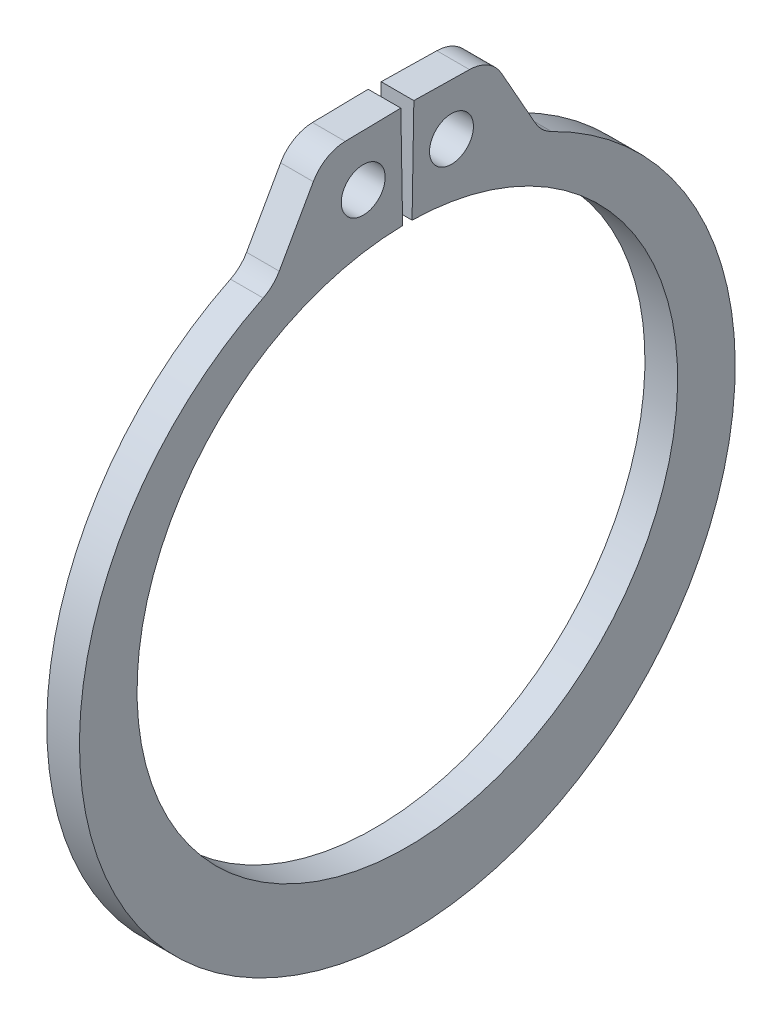
ISO-10303-21;
HEADER;
FILE_DESCRIPTION(('STEP AP214'),'2;1');
FILE_NAME('part.step','',(''),(''),'','','');
FILE_SCHEMA(('AUTOMOTIVE_DESIGN { 1 0 10303 214 1 1 1 1 }'));
ENDSEC;
DATA;
#1=APPLICATION_CONTEXT('core data for automotive mechanical design processes');
#2=APPLICATION_PROTOCOL_DEFINITION('international standard','automotive_design',2000,#1);
#3=PRODUCT_CONTEXT('',#1,'mechanical');
#4=PRODUCT('Part','Part','',(#3));
#5=PRODUCT_RELATED_PRODUCT_CATEGORY('part','',(#4));
#6=PRODUCT_DEFINITION_FORMATION('','',#4);
#7=PRODUCT_DEFINITION_CONTEXT('part definition',#1,'design');
#8=PRODUCT_DEFINITION('design','',#6,#7);
#9=PRODUCT_DEFINITION_SHAPE('','',#8);
#10=(LENGTH_UNIT() NAMED_UNIT(*) SI_UNIT(.MILLI.,.METRE.));
#11=(NAMED_UNIT(*) PLANE_ANGLE_UNIT() SI_UNIT($,.RADIAN.));
#12=(NAMED_UNIT(*) SI_UNIT($,.STERADIAN.) SOLID_ANGLE_UNIT());
#13=UNCERTAINTY_MEASURE_WITH_UNIT(LENGTH_MEASURE(1.E-05),#10,'distance_accuracy_value','');
#14=(GEOMETRIC_REPRESENTATION_CONTEXT(3) GLOBAL_UNCERTAINTY_ASSIGNED_CONTEXT((#13)) GLOBAL_UNIT_ASSIGNED_CONTEXT((#10,
#11,#12)) REPRESENTATION_CONTEXT('',''));
#15=CARTESIAN_POINT('',(0.,0.,0.));
#16=DIRECTION('',(0.,0.,1.));
#17=DIRECTION('',(1.,0.,0.));
#18=AXIS2_PLACEMENT_3D('',#15,#16,#17);
#19=CARTESIAN_POINT('',(0.4445,0.,0.));
#20=DIRECTION('',(1.,0.,0.));
#21=DIRECTION('',(0.,0.,-1.));
#22=AXIS2_PLACEMENT_3D('',#19,#20,#21);
#23=PLANE('',#22);
#24=CARTESIAN_POINT('',(0.4445,8.73068152808226,1.20030421464827));
#25=DIRECTION('',(1.,0.,0.));
#26=DIRECTION('',(0.,0.,-1.));
#27=AXIS2_PLACEMENT_3D('',#24,#25,#26);
#28=CIRCLE('',#27,0.5969);
#29=CARTESIAN_POINT('',(0.4445,8.73068152808226,0.603404214648273));
#30=VERTEX_POINT('',#29);
#31=EDGE_CURVE('E221',#30,#30,#28,.T.);
#32=ORIENTED_EDGE('',*,*,#31,.F.);
#33=EDGE_LOOP('',(#32));
#34=FACE_BOUND('',#33,.T.);
#35=DIRECTION('',(0.,-0.0174524064372936,0.999847695156391));
#36=VECTOR('',#35,1.);
#37=CARTESIAN_POINT('',(0.4445,10.1457545170605,0.177094803841047));
#38=LINE('',#37,#36);
#39=CARTESIAN_POINT('',(0.4445,10.1457545170605,0.177094803841047));
#40=VERTEX_POINT('',#39);
#41=CARTESIAN_POINT('',(0.4445,10.119336918889,1.69055798946166));
#42=VERTEX_POINT('',#41);
#43=EDGE_CURVE('E133',#40,#42,#38,.T.);
#44=ORIENTED_EDGE('',*,*,#43,.T.);
#45=CARTESIAN_POINT('',(0.4445,9.10349166061007,1.67282634452137));
#46=DIRECTION('',(1.,0.,0.));
#47=DIRECTION('',(0.,0.,-1.));
#48=AXIS2_PLACEMENT_3D('',#45,#46,#47);
#49=CIRCLE('',#48,1.016);
#50=CARTESIAN_POINT('',(0.4445,9.60233176743068,2.55793342721092));
#51=VERTEX_POINT('',#50);
#52=EDGE_CURVE('E174',#42,#51,#49,.T.);
#53=ORIENTED_EDGE('',*,*,#52,.T.);
#54=DIRECTION('',(0.,-0.871168388473964,0.4909843571069));
#55=VECTOR('',#54,1.);
#56=CARTESIAN_POINT('',(0.4445,10.1091829993711,2.27227564904127));
#57=LINE('',#56,#55);
#58=CARTESIAN_POINT('',(0.4445,7.95816620199856,3.48457353927362));
#59=VERTEX_POINT('',#58);
#60=EDGE_CURVE('E213',#51,#59,#57,.T.);
#61=ORIENTED_EDGE('',*,*,#60,.T.);
#62=CARTESIAN_POINT('',(0.4445,8.45700630881917,4.36968062196317));
#63=DIRECTION('',(1.,0.,0.));
#64=DIRECTION('',(0.,0.,-1.));
#65=AXIS2_PLACEMENT_3D('',#62,#63,#64);
#66=CIRCLE('',#65,1.016);
#67=CARTESIAN_POINT('',(0.4445,7.54454551575573,3.92283467409964));
#68=VERTEX_POINT('',#67);
#69=EDGE_CURVE('E181',#59,#68,#66,.F.);
#70=ORIENTED_EDGE('',*,*,#69,.T.);
#71=CARTESIAN_POINT('',(0.4445,-0.465894894188205,0.));
#72=DIRECTION('',(1.,0.,0.));
#73=DIRECTION('',(0.,0.,-1.));
#74=AXIS2_PLACEMENT_3D('',#71,#72,#73);
#75=CIRCLE('',#74,8.91940510581178);
#76=CARTESIAN_POINT('',(0.4445,7.54454551575573,-3.92283467409964));
#77=VERTEX_POINT('',#76);
#78=EDGE_CURVE('E206',#68,#77,#75,.T.);
#79=ORIENTED_EDGE('',*,*,#78,.T.);
#80=CARTESIAN_POINT('',(0.4445,8.45700630881917,-4.36968062196317));
#81=DIRECTION('',(1.,0.,0.));
#82=DIRECTION('',(0.,0.,-1.));
#83=AXIS2_PLACEMENT_3D('',#80,#81,#82);
#84=CIRCLE('',#83,1.016);
#85=CARTESIAN_POINT('',(0.4445,7.95816620199856,-3.48457353927362));
#86=VERTEX_POINT('',#85);
#87=EDGE_CURVE('E11',#77,#86,#84,.F.);
#88=ORIENTED_EDGE('',*,*,#87,.T.);
#89=DIRECTION('',(0.,0.871168388473964,0.4909843571069));
#90=VECTOR('',#89,1.);
#91=CARTESIAN_POINT('',(0.4445,10.1091829993711,-2.27227564904127));
#92=LINE('',#91,#90);
#93=CARTESIAN_POINT('',(0.4445,9.60233176743068,-2.55793342721092));
#94=VERTEX_POINT('',#93);
#95=EDGE_CURVE('E205',#86,#94,#92,.T.);
#96=ORIENTED_EDGE('',*,*,#95,.T.);
#97=CARTESIAN_POINT('',(0.4445,9.10349166061007,-1.67282634452137));
#98=DIRECTION('',(1.,0.,0.));
#99=DIRECTION('',(0.,0.,-1.));
#100=AXIS2_PLACEMENT_3D('',#97,#98,#99);
#101=CIRCLE('',#100,1.016);
#102=CARTESIAN_POINT('',(0.4445,10.119336918889,-1.69055798946166));
#103=VERTEX_POINT('',#102);
#104=EDGE_CURVE('E49',#94,#103,#101,.T.);
#105=ORIENTED_EDGE('',*,*,#104,.T.);
#106=DIRECTION('',(0.,0.0174524064372936,0.999847695156391));
#107=VECTOR('',#106,1.);
#108=CARTESIAN_POINT('',(0.4445,10.1457545170605,-0.177094803841047));
#109=LINE('',#108,#107);
#110=CARTESIAN_POINT('',(0.4445,10.1457545170605,-0.177094803841047));
#111=VERTEX_POINT('',#110);
#112=EDGE_CURVE('E210',#103,#111,#109,.T.);
#113=ORIENTED_EDGE('',*,*,#112,.T.);
#114=DIRECTION('',(0.,-0.999847695156391,0.0174524064372833));
#115=VECTOR('',#114,1.);
#116=CARTESIAN_POINT('',(0.4445,7.35218005679349,-0.128332780255277));
#117=LINE('',#116,#115);
#118=CARTESIAN_POINT('',(0.4445,7.35218005679349,-0.128332780255277));
#119=VERTEX_POINT('',#118);
#120=EDGE_CURVE('E139',#111,#119,#117,.T.);
#121=ORIENTED_EDGE('',*,*,#120,.T.);
#122=CARTESIAN_POINT('',(0.4445,0.,0.));
#123=DIRECTION('',(-1.,0.,0.));
#124=DIRECTION('',(0.,0.,-1.));
#125=AXIS2_PLACEMENT_3D('',#122,#123,#124);
#126=CIRCLE('',#125,7.35329999999999);
#127=CARTESIAN_POINT('',(0.4445,7.35218005679349,0.128332780255277));
#128=VERTEX_POINT('',#127);
#129=EDGE_CURVE('E134',#119,#128,#126,.T.);
#130=ORIENTED_EDGE('',*,*,#129,.T.);
#131=DIRECTION('',(0.,0.999847695156391,0.0174524064372833));
#132=VECTOR('',#131,1.);
#133=CARTESIAN_POINT('',(0.4445,7.35218005679349,0.128332780255277));
#134=LINE('',#133,#132);
#135=EDGE_CURVE('E125',#128,#40,#134,.T.);
#136=ORIENTED_EDGE('',*,*,#135,.T.);
#137=EDGE_LOOP('',(#44,#53,#61,#70,#79,#88,#96,#105,#113,#121,#130,#136));
#138=FACE_BOUND('',#137,.T.);
#139=CARTESIAN_POINT('',(0.4445,8.73068152808226,-1.20030421464827));
#140=DIRECTION('',(1.,0.,0.));
#141=DIRECTION('',(0.,0.,-1.));
#142=AXIS2_PLACEMENT_3D('',#139,#140,#141);
#143=CIRCLE('',#142,0.5969);
#144=CARTESIAN_POINT('',(0.4445,8.73068152808226,-1.79720421464827));
#145=VERTEX_POINT('',#144);
#146=EDGE_CURVE('E247',#145,#145,#143,.T.);
#147=ORIENTED_EDGE('',*,*,#146,.F.);
#148=EDGE_LOOP('',(#147));
#149=FACE_BOUND('',#148,.T.);
#150=ADVANCED_FACE('F34',(#34,#138,#149),#23,.T.);
#151=CARTESIAN_POINT('',(-0.4445,0.,0.));
#152=DIRECTION('',(1.,0.,0.));
#153=DIRECTION('',(0.,0.,-1.));
#154=AXIS2_PLACEMENT_3D('',#151,#152,#153);
#155=PLANE('',#154);
#156=CARTESIAN_POINT('',(-0.4445,8.73068152808226,1.20030421464827));
#157=DIRECTION('',(1.,0.,0.));
#158=DIRECTION('',(0.,0.,-1.));
#159=AXIS2_PLACEMENT_3D('',#156,#157,#158);
#160=CIRCLE('',#159,0.5969);
#161=CARTESIAN_POINT('',(-0.4445,8.73068152808226,0.603404214648273));
#162=VERTEX_POINT('',#161);
#163=EDGE_CURVE('E244',#162,#162,#160,.T.);
#164=ORIENTED_EDGE('',*,*,#163,.T.);
#165=EDGE_LOOP('',(#164));
#166=FACE_BOUND('',#165,.T.);
#167=DIRECTION('',(0.,-0.871168388473964,0.4909843571069));
#168=VECTOR('',#167,1.);
#169=CARTESIAN_POINT('',(-0.4445,10.1091829993711,2.27227564904127));
#170=LINE('',#169,#168);
#171=CARTESIAN_POINT('',(-0.4445,9.60233176743068,2.55793342721092));
#172=VERTEX_POINT('',#171);
#173=CARTESIAN_POINT('',(-0.4445,7.95816620199856,3.48457353927362));
#174=VERTEX_POINT('',#173);
#175=EDGE_CURVE('E200',#172,#174,#170,.T.);
#176=ORIENTED_EDGE('',*,*,#175,.F.);
#177=CARTESIAN_POINT('',(-0.4445,9.10349166061007,1.67282634452137));
#178=DIRECTION('',(1.,0.,0.));
#179=DIRECTION('',(0.,0.,-1.));
#180=AXIS2_PLACEMENT_3D('',#177,#178,#179);
#181=CIRCLE('',#180,1.016);
#182=CARTESIAN_POINT('',(-0.4445,10.119336918889,1.69055798946166));
#183=VERTEX_POINT('',#182);
#184=EDGE_CURVE('E170',#172,#183,#181,.F.);
#185=ORIENTED_EDGE('',*,*,#184,.T.);
#186=DIRECTION('',(0.,-0.0174524064372936,0.999847695156391));
#187=VECTOR('',#186,1.);
#188=CARTESIAN_POINT('',(-0.4445,10.1457545170605,0.177094803841047));
#189=LINE('',#188,#187);
#190=CARTESIAN_POINT('',(-0.4445,10.1457545170605,0.177094803841047));
#191=VERTEX_POINT('',#190);
#192=EDGE_CURVE('E223',#191,#183,#189,.T.);
#193=ORIENTED_EDGE('',*,*,#192,.F.);
#194=DIRECTION('',(0.,0.999847695156391,0.0174524064372833));
#195=VECTOR('',#194,1.);
#196=CARTESIAN_POINT('',(-0.4445,7.35218005679349,0.128332780255277));
#197=LINE('',#196,#195);
#198=CARTESIAN_POINT('',(-0.4445,7.35218005679349,0.128332780255277));
#199=VERTEX_POINT('',#198);
#200=EDGE_CURVE('E220',#199,#191,#197,.T.);
#201=ORIENTED_EDGE('',*,*,#200,.F.);
#202=CARTESIAN_POINT('',(-0.4445,0.,0.));
#203=DIRECTION('',(-1.,0.,0.));
#204=DIRECTION('',(0.,0.,-1.));
#205=AXIS2_PLACEMENT_3D('',#202,#203,#204);
#206=CIRCLE('',#205,7.35329999999999);
#207=CARTESIAN_POINT('',(-0.4445,7.35218005679349,-0.128332780255277));
#208=VERTEX_POINT('',#207);
#209=EDGE_CURVE('E147',#208,#199,#206,.T.);
#210=ORIENTED_EDGE('',*,*,#209,.F.);
#211=DIRECTION('',(0.,-0.999847695156391,0.0174524064372833));
#212=VECTOR('',#211,1.);
#213=CARTESIAN_POINT('',(-0.4445,7.35218005679349,-0.128332780255277));
#214=LINE('',#213,#212);
#215=CARTESIAN_POINT('',(-0.4445,10.1457545170605,-0.177094803841047));
#216=VERTEX_POINT('',#215);
#217=EDGE_CURVE('E143',#216,#208,#214,.T.);
#218=ORIENTED_EDGE('',*,*,#217,.F.);
#219=DIRECTION('',(0.,0.0174524064372936,0.999847695156391));
#220=VECTOR('',#219,1.);
#221=CARTESIAN_POINT('',(-0.4445,10.1457545170605,-0.177094803841047));
#222=LINE('',#221,#220);
#223=CARTESIAN_POINT('',(-0.4445,10.119336918889,-1.69055798946166));
#224=VERTEX_POINT('',#223);
#225=EDGE_CURVE('E228',#224,#216,#222,.T.);
#226=ORIENTED_EDGE('',*,*,#225,.F.);
#227=CARTESIAN_POINT('',(-0.4445,9.10349166061007,-1.67282634452137));
#228=DIRECTION('',(1.,0.,0.));
#229=DIRECTION('',(0.,0.,-1.));
#230=AXIS2_PLACEMENT_3D('',#227,#228,#229);
#231=CIRCLE('',#230,1.016);
#232=CARTESIAN_POINT('',(-0.4445,9.60233176743068,-2.55793342721092));
#233=VERTEX_POINT('',#232);
#234=EDGE_CURVE('E168',#224,#233,#231,.F.);
#235=ORIENTED_EDGE('',*,*,#234,.T.);
#236=DIRECTION('',(0.,0.871168388473964,0.4909843571069));
#237=VECTOR('',#236,1.);
#238=CARTESIAN_POINT('',(-0.4445,10.1091829993711,-2.27227564904127));
#239=LINE('',#238,#237);
#240=CARTESIAN_POINT('',(-0.4445,7.95816620199856,-3.48457353927362));
#241=VERTEX_POINT('',#240);
#242=EDGE_CURVE('E191',#241,#233,#239,.T.);
#243=ORIENTED_EDGE('',*,*,#242,.F.);
#244=CARTESIAN_POINT('',(-0.4445,8.45700630881917,-4.36968062196317));
#245=DIRECTION('',(1.,0.,0.));
#246=DIRECTION('',(0.,0.,-1.));
#247=AXIS2_PLACEMENT_3D('',#244,#245,#246);
#248=CIRCLE('',#247,1.016);
#249=CARTESIAN_POINT('',(-0.4445,7.54454551575573,-3.92283467409964));
#250=VERTEX_POINT('',#249);
#251=EDGE_CURVE('E42',#241,#250,#248,.T.);
#252=ORIENTED_EDGE('',*,*,#251,.T.);
#253=CARTESIAN_POINT('',(-0.4445,-0.465894894188205,0.));
#254=DIRECTION('',(1.,0.,0.));
#255=DIRECTION('',(0.,0.,-1.));
#256=AXIS2_PLACEMENT_3D('',#253,#254,#255);
#257=CIRCLE('',#256,8.91940510581178);
#258=CARTESIAN_POINT('',(-0.4445,7.54454551575573,3.92283467409964));
#259=VERTEX_POINT('',#258);
#260=EDGE_CURVE('E189',#259,#250,#257,.T.);
#261=ORIENTED_EDGE('',*,*,#260,.F.);
#262=CARTESIAN_POINT('',(-0.4445,8.45700630881917,4.36968062196317));
#263=DIRECTION('',(1.,0.,0.));
#264=DIRECTION('',(0.,0.,-1.));
#265=AXIS2_PLACEMENT_3D('',#262,#263,#264);
#266=CIRCLE('',#265,1.016);
#267=EDGE_CURVE('E179',#259,#174,#266,.T.);
#268=ORIENTED_EDGE('',*,*,#267,.T.);
#269=EDGE_LOOP('',(#176,#185,#193,#201,#210,#218,#226,#235,#243,#252,#261,#268));
#270=FACE_BOUND('',#269,.T.);
#271=CARTESIAN_POINT('',(-0.4445,8.73068152808226,-1.20030421464827));
#272=DIRECTION('',(1.,0.,0.));
#273=DIRECTION('',(0.,0.,-1.));
#274=AXIS2_PLACEMENT_3D('',#271,#272,#273);
#275=CIRCLE('',#274,0.5969);
#276=CARTESIAN_POINT('',(-0.4445,8.73068152808226,-1.79720421464827));
#277=VERTEX_POINT('',#276);
#278=EDGE_CURVE('E250',#277,#277,#275,.T.);
#279=ORIENTED_EDGE('',*,*,#278,.T.);
#280=EDGE_LOOP('',(#279));
#281=FACE_BOUND('',#280,.T.);
#282=ADVANCED_FACE('F187',(#166,#270,#281),#155,.F.);
#283=CARTESIAN_POINT('',(0.4445,0.,0.));
#284=DIRECTION('',(-1.,0.,0.));
#285=DIRECTION('',(0.,0.,1.));
#286=AXIS2_PLACEMENT_3D('',#283,#284,#285);
#287=CYLINDRICAL_SURFACE('',#286,7.35329999999999);
#288=ORIENTED_EDGE('',*,*,#209,.T.);
#289=DIRECTION('',(-1.,0.,0.));
#290=VECTOR('',#289,1.);
#291=CARTESIAN_POINT('',(0.4445,7.35218005679349,0.128332780255277));
#292=LINE('',#291,#290);
#293=EDGE_CURVE('E129',#128,#199,#292,.T.);
#294=ORIENTED_EDGE('',*,*,#293,.F.);
#295=ORIENTED_EDGE('',*,*,#129,.F.);
#296=DIRECTION('',(-1.,0.,0.));
#297=VECTOR('',#296,1.);
#298=CARTESIAN_POINT('',(0.4445,7.35218005679349,-0.128332780255277));
#299=LINE('',#298,#297);
#300=EDGE_CURVE('E218',#119,#208,#299,.T.);
#301=ORIENTED_EDGE('',*,*,#300,.T.);
#302=EDGE_LOOP('',(#288,#294,#295,#301));
#303=FACE_BOUND('',#302,.T.);
#304=ADVANCED_FACE('F145',(#303),#287,.F.);
#305=CARTESIAN_POINT('',(0.4445,7.35218005679349,0.128332780255277));
#306=DIRECTION('',(0.,-0.0174524064372833,0.999847695156391));
#307=DIRECTION('',(0.,-0.999847695156391,-0.0174524064372833));
#308=AXIS2_PLACEMENT_3D('',#305,#306,#307);
#309=PLANE('',#308);
#310=ORIENTED_EDGE('',*,*,#200,.T.);
#311=DIRECTION('',(-1.,0.,0.));
#312=VECTOR('',#311,1.);
#313=CARTESIAN_POINT('',(0.4445,10.1457545170605,0.177094803841047));
#314=LINE('',#313,#312);
#315=EDGE_CURVE('E132',#40,#191,#314,.T.);
#316=ORIENTED_EDGE('',*,*,#315,.F.);
#317=ORIENTED_EDGE('',*,*,#135,.F.);
#318=ORIENTED_EDGE('',*,*,#293,.T.);
#319=EDGE_LOOP('',(#310,#316,#317,#318));
#320=FACE_BOUND('',#319,.T.);
#321=ADVANCED_FACE('F127',(#320),#309,.F.);
#322=CARTESIAN_POINT('',(0.4445,10.1457545170605,0.177094803841047));
#323=DIRECTION('',(0.,-0.999847695156391,-0.0174524064372936));
#324=DIRECTION('',(0.,0.0174524064372936,-0.999847695156391));
#325=AXIS2_PLACEMENT_3D('',#322,#323,#324);
#326=PLANE('',#325);
#327=ORIENTED_EDGE('',*,*,#192,.T.);
#328=DIRECTION('',(-1.,0.,0.));
#329=VECTOR('',#328,1.);
#330=CARTESIAN_POINT('',(0.4445,10.119336918889,1.69055798946166));
#331=LINE('',#330,#329);
#332=EDGE_CURVE('E57',#183,#42,#331,.F.);
#333=ORIENTED_EDGE('',*,*,#332,.T.);
#334=ORIENTED_EDGE('',*,*,#43,.F.);
#335=ORIENTED_EDGE('',*,*,#315,.T.);
#336=EDGE_LOOP('',(#327,#333,#334,#335));
#337=FACE_BOUND('',#336,.T.);
#338=ADVANCED_FACE('F239',(#337),#326,.F.);
#339=CARTESIAN_POINT('',(0.4445,10.1091829993711,2.27227564904127));
#340=DIRECTION('',(0.,-0.4909843571069,-0.871168388473964));
#341=DIRECTION('',(0.,0.871168388473964,-0.4909843571069));
#342=AXIS2_PLACEMENT_3D('',#339,#340,#341);
#343=PLANE('',#342);
#344=ORIENTED_EDGE('',*,*,#175,.T.);
#345=DIRECTION('',(1.,0.,0.));
#346=VECTOR('',#345,1.);
#347=CARTESIAN_POINT('',(0.4445,7.95816620199856,3.48457353927362));
#348=LINE('',#347,#346);
#349=EDGE_CURVE('E161',#174,#59,#348,.T.);
#350=ORIENTED_EDGE('',*,*,#349,.T.);
#351=ORIENTED_EDGE('',*,*,#60,.F.);
#352=DIRECTION('',(-1.,0.,0.));
#353=VECTOR('',#352,1.);
#354=CARTESIAN_POINT('',(0.4445,9.60233176743068,2.55793342721092));
#355=LINE('',#354,#353);
#356=EDGE_CURVE('E158',#51,#172,#355,.T.);
#357=ORIENTED_EDGE('',*,*,#356,.T.);
#358=EDGE_LOOP('',(#344,#350,#351,#357));
#359=FACE_BOUND('',#358,.T.);
#360=ADVANCED_FACE('F280',(#359),#343,.F.);
#361=CARTESIAN_POINT('',(0.4445,-0.465894894188205,0.));
#362=DIRECTION('',(-1.,0.,0.));
#363=DIRECTION('',(0.,0.,1.));
#364=AXIS2_PLACEMENT_3D('',#361,#362,#363);
#365=CYLINDRICAL_SURFACE('',#364,8.91940510581178);
#366=ORIENTED_EDGE('',*,*,#78,.F.);
#367=DIRECTION('',(-1.,0.,0.));
#368=VECTOR('',#367,1.);
#369=CARTESIAN_POINT('',(0.4445,7.54454551575573,3.92283467409964));
#370=LINE('',#369,#368);
#371=EDGE_CURVE('E150',#68,#259,#370,.T.);
#372=ORIENTED_EDGE('',*,*,#371,.T.);
#373=ORIENTED_EDGE('',*,*,#260,.T.);
#374=DIRECTION('',(-1.,0.,0.));
#375=VECTOR('',#374,1.);
#376=CARTESIAN_POINT('',(0.4445,7.54454551575573,-3.92283467409964));
#377=LINE('',#376,#375);
#378=EDGE_CURVE('E148',#250,#77,#377,.F.);
#379=ORIENTED_EDGE('',*,*,#378,.T.);
#380=EDGE_LOOP('',(#366,#372,#373,#379));
#381=FACE_BOUND('',#380,.T.);
#382=ADVANCED_FACE('F197',(#381),#365,.T.);
#383=CARTESIAN_POINT('',(0.4445,10.1091829993711,-2.27227564904127));
#384=DIRECTION('',(0.,-0.4909843571069,0.871168388473964));
#385=DIRECTION('',(0.,-0.871168388473964,-0.4909843571069));
#386=AXIS2_PLACEMENT_3D('',#383,#384,#385);
#387=PLANE('',#386);
#388=ORIENTED_EDGE('',*,*,#95,.F.);
#389=DIRECTION('',(1.,0.,0.));
#390=VECTOR('',#389,1.);
#391=CARTESIAN_POINT('',(-0.4445,7.95816620199856,-3.48457353927362));
#392=LINE('',#391,#390);
#393=EDGE_CURVE('E165',#86,#241,#392,.F.);
#394=ORIENTED_EDGE('',*,*,#393,.T.);
#395=ORIENTED_EDGE('',*,*,#242,.T.);
#396=DIRECTION('',(-1.,0.,0.));
#397=VECTOR('',#396,1.);
#398=CARTESIAN_POINT('',(0.4445,9.60233176743068,-2.55793342721092));
#399=LINE('',#398,#397);
#400=EDGE_CURVE('E163',#233,#94,#399,.F.);
#401=ORIENTED_EDGE('',*,*,#400,.T.);
#402=EDGE_LOOP('',(#388,#394,#395,#401));
#403=FACE_BOUND('',#402,.T.);
#404=ADVANCED_FACE('F208',(#403),#387,.F.);
#405=CARTESIAN_POINT('',(0.4445,10.1457545170605,-0.177094803841047));
#406=DIRECTION('',(0.,-0.999847695156391,0.0174524064372936));
#407=DIRECTION('',(0.,-0.0174524064372936,-0.999847695156391));
#408=AXIS2_PLACEMENT_3D('',#405,#406,#407);
#409=PLANE('',#408);
#410=ORIENTED_EDGE('',*,*,#112,.F.);
#411=DIRECTION('',(-1.,0.,0.));
#412=VECTOR('',#411,1.);
#413=CARTESIAN_POINT('',(0.4445,10.119336918889,-1.69055798946166));
#414=LINE('',#413,#412);
#415=EDGE_CURVE('E176',#103,#224,#414,.T.);
#416=ORIENTED_EDGE('',*,*,#415,.T.);
#417=ORIENTED_EDGE('',*,*,#225,.T.);
#418=DIRECTION('',(-1.,0.,0.));
#419=VECTOR('',#418,1.);
#420=CARTESIAN_POINT('',(0.4445,10.1457545170605,-0.177094803841047));
#421=LINE('',#420,#419);
#422=EDGE_CURVE('E152',#111,#216,#421,.T.);
#423=ORIENTED_EDGE('',*,*,#422,.F.);
#424=EDGE_LOOP('',(#410,#416,#417,#423));
#425=FACE_BOUND('',#424,.T.);
#426=ADVANCED_FACE('F273',(#425),#409,.F.);
#427=CARTESIAN_POINT('',(0.4445,7.35218005679349,-0.128332780255277));
#428=DIRECTION('',(0.,-0.0174524064372833,-0.999847695156391));
#429=DIRECTION('',(0.,0.999847695156391,-0.0174524064372833));
#430=AXIS2_PLACEMENT_3D('',#427,#428,#429);
#431=PLANE('',#430);
#432=ORIENTED_EDGE('',*,*,#217,.T.);
#433=ORIENTED_EDGE('',*,*,#300,.F.);
#434=ORIENTED_EDGE('',*,*,#120,.F.);
#435=ORIENTED_EDGE('',*,*,#422,.T.);
#436=EDGE_LOOP('',(#432,#433,#434,#435));
#437=FACE_BOUND('',#436,.T.);
#438=ADVANCED_FACE('F235',(#437),#431,.F.);
#439=CARTESIAN_POINT('',(0.4445,8.73068152808226,1.20030421464827));
#440=DIRECTION('',(-1.,0.,0.));
#441=DIRECTION('',(0.,0.,1.));
#442=AXIS2_PLACEMENT_3D('',#439,#440,#441);
#443=CYLINDRICAL_SURFACE('',#442,0.5969);
#444=ORIENTED_EDGE('',*,*,#31,.T.);
#445=EDGE_LOOP('',(#444));
#446=FACE_BOUND('',#445,.T.);
#447=ORIENTED_EDGE('',*,*,#163,.F.);
#448=EDGE_LOOP('',(#447));
#449=FACE_BOUND('',#448,.T.);
#450=ADVANCED_FACE('F268',(#446,#449),#443,.F.);
#451=CARTESIAN_POINT('',(0.4445,8.73068152808226,-1.20030421464827));
#452=DIRECTION('',(-1.,0.,0.));
#453=DIRECTION('',(0.,0.,1.));
#454=AXIS2_PLACEMENT_3D('',#451,#452,#453);
#455=CYLINDRICAL_SURFACE('',#454,0.5969);
#456=ORIENTED_EDGE('',*,*,#146,.T.);
#457=EDGE_LOOP('',(#456));
#458=FACE_BOUND('',#457,.T.);
#459=ORIENTED_EDGE('',*,*,#278,.F.);
#460=EDGE_LOOP('',(#459));
#461=FACE_BOUND('',#460,.T.);
#462=ADVANCED_FACE('F256',(#458,#461),#455,.F.);
#463=CARTESIAN_POINT('',(0.4445,8.45700630881917,4.36968062196317));
#464=DIRECTION('',(-1.,0.,0.));
#465=DIRECTION('',(0.,0.,1.));
#466=AXIS2_PLACEMENT_3D('',#463,#464,#465);
#467=CYLINDRICAL_SURFACE('',#466,1.016);
#468=ORIENTED_EDGE('',*,*,#69,.F.);
#469=ORIENTED_EDGE('',*,*,#349,.F.);
#470=ORIENTED_EDGE('',*,*,#267,.F.);
#471=ORIENTED_EDGE('',*,*,#371,.F.);
#472=EDGE_LOOP('',(#468,#469,#470,#471));
#473=FACE_BOUND('',#472,.T.);
#474=ADVANCED_FACE('F290',(#473),#467,.F.);
#475=CARTESIAN_POINT('',(0.4445,8.45700630881917,-4.36968062196317));
#476=DIRECTION('',(-1.,0.,0.));
#477=DIRECTION('',(0.,0.,1.));
#478=AXIS2_PLACEMENT_3D('',#475,#476,#477);
#479=CYLINDRICAL_SURFACE('',#478,1.016);
#480=ORIENTED_EDGE('',*,*,#87,.F.);
#481=ORIENTED_EDGE('',*,*,#378,.F.);
#482=ORIENTED_EDGE('',*,*,#251,.F.);
#483=ORIENTED_EDGE('',*,*,#393,.F.);
#484=EDGE_LOOP('',(#480,#481,#482,#483));
#485=FACE_BOUND('',#484,.T.);
#486=ADVANCED_FACE('F203',(#485),#479,.F.);
#487=CARTESIAN_POINT('',(0.4445,9.10349166061007,1.67282634452137));
#488=DIRECTION('',(-1.,0.,0.));
#489=DIRECTION('',(0.,0.,1.));
#490=AXIS2_PLACEMENT_3D('',#487,#488,#489);
#491=CYLINDRICAL_SURFACE('',#490,1.016);
#492=ORIENTED_EDGE('',*,*,#52,.F.);
#493=ORIENTED_EDGE('',*,*,#332,.F.);
#494=ORIENTED_EDGE('',*,*,#184,.F.);
#495=ORIENTED_EDGE('',*,*,#356,.F.);
#496=EDGE_LOOP('',(#492,#493,#494,#495));
#497=FACE_BOUND('',#496,.T.);
#498=ADVANCED_FACE('F295',(#497),#491,.T.);
#499=CARTESIAN_POINT('',(0.4445,9.10349166061007,-1.67282634452137));
#500=DIRECTION('',(-1.,0.,0.));
#501=DIRECTION('',(0.,0.,1.));
#502=AXIS2_PLACEMENT_3D('',#499,#500,#501);
#503=CYLINDRICAL_SURFACE('',#502,1.016);
#504=ORIENTED_EDGE('',*,*,#104,.F.);
#505=ORIENTED_EDGE('',*,*,#400,.F.);
#506=ORIENTED_EDGE('',*,*,#234,.F.);
#507=ORIENTED_EDGE('',*,*,#415,.F.);
#508=EDGE_LOOP('',(#504,#505,#506,#507));
#509=FACE_BOUND('',#508,.T.);
#510=ADVANCED_FACE('F36',(#509),#503,.T.);
#511=CLOSED_SHELL('',(#150,#282,#304,#321,#338,#360,#382,#404,#426,#438,#450,#462,#474,#486,
#498,#510));
#512=MANIFOLD_SOLID_BREP('B2',#511);
#513=ADVANCED_BREP_SHAPE_REPRESENTATION('',(#18,#512),#14);
#514=SHAPE_DEFINITION_REPRESENTATION(#9,#513);
ENDSEC;
END-ISO-10303-21;
